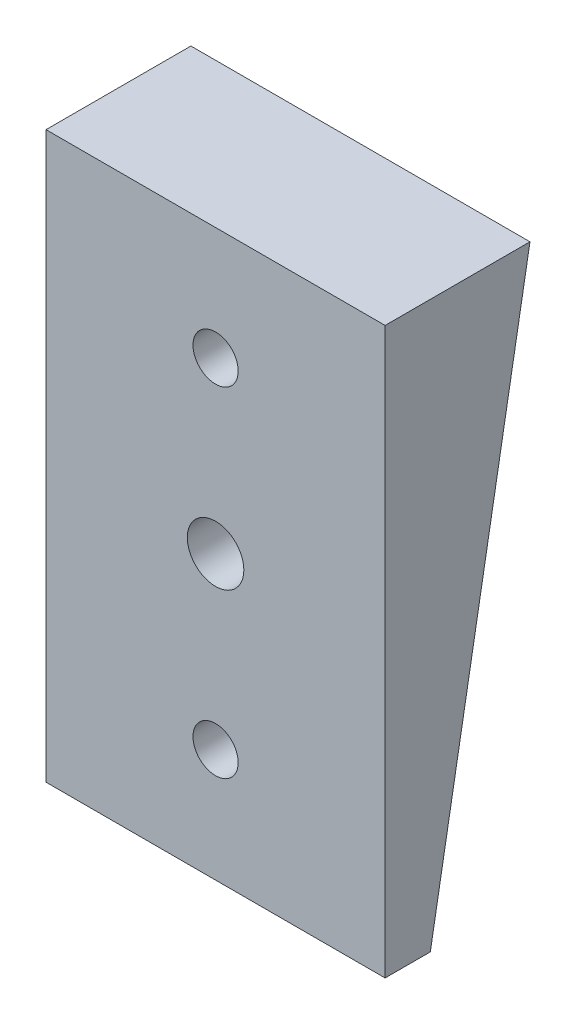
ISO-10303-21;
HEADER;
FILE_DESCRIPTION(('STEP AP214'),'2;1');
FILE_NAME('part.step','',(''),(''),'','','');
FILE_SCHEMA(('AUTOMOTIVE_DESIGN { 1 0 10303 214 1 1 1 1 }'));
ENDSEC;
DATA;
#1=APPLICATION_CONTEXT('core data for automotive mechanical design processes');
#2=APPLICATION_PROTOCOL_DEFINITION('international standard','automotive_design',2000,#1);
#3=PRODUCT_CONTEXT('',#1,'mechanical');
#4=PRODUCT('Part','Part','',(#3));
#5=PRODUCT_RELATED_PRODUCT_CATEGORY('part','',(#4));
#6=PRODUCT_DEFINITION_FORMATION('','',#4);
#7=PRODUCT_DEFINITION_CONTEXT('part definition',#1,'design');
#8=PRODUCT_DEFINITION('design','',#6,#7);
#9=PRODUCT_DEFINITION_SHAPE('','',#8);
#10=(LENGTH_UNIT() NAMED_UNIT(*) SI_UNIT(.MILLI.,.METRE.));
#11=(NAMED_UNIT(*) PLANE_ANGLE_UNIT() SI_UNIT($,.RADIAN.));
#12=(NAMED_UNIT(*) SI_UNIT($,.STERADIAN.) SOLID_ANGLE_UNIT());
#13=UNCERTAINTY_MEASURE_WITH_UNIT(LENGTH_MEASURE(1.E-05),#10,'distance_accuracy_value','');
#14=(GEOMETRIC_REPRESENTATION_CONTEXT(3) GLOBAL_UNCERTAINTY_ASSIGNED_CONTEXT((#13)) GLOBAL_UNIT_ASSIGNED_CONTEXT((#10,
#11,#12)) REPRESENTATION_CONTEXT('',''));
#15=CARTESIAN_POINT('',(0.,0.,0.));
#16=DIRECTION('',(0.,0.,1.));
#17=DIRECTION('',(1.,0.,0.));
#18=AXIS2_PLACEMENT_3D('',#15,#16,#17);
#19=CARTESIAN_POINT('',(30.,50.,-21.6326980708465));
#20=DIRECTION('',(0.,0.173648177666931,0.984807753012208));
#21=DIRECTION('',(0.,-0.984807753012208,0.173648177666931));
#22=AXIS2_PLACEMENT_3D('',#19,#20,#21);
#23=PLANE('',#22);
#24=CARTESIAN_POINT('',(0.,-30.,-7.52653961416931));
#25=DIRECTION('',(0.,0.173648177666931,0.984807753012208));
#26=DIRECTION('',(0.,-0.984807753012208,0.173648177666931));
#27=AXIS2_PLACEMENT_3D('',#24,#25,#26);
#28=ELLIPSE('',#27,4.06170644754298,4.);
#29=CARTESIAN_POINT('',(0.,-34.,-6.82123169133545));
#30=VERTEX_POINT('',#29);
#31=EDGE_CURVE('E105',#30,#30,#28,.T.);
#32=ORIENTED_EDGE('',*,*,#31,.T.);
#33=EDGE_LOOP('',(#32));
#34=FACE_BOUND('',#33,.T.);
#35=CARTESIAN_POINT('',(0.,30.,-18.1061584566772));
#36=DIRECTION('',(0.,0.173648177666931,0.984807753012208));
#37=DIRECTION('',(0.,-0.984807753012208,0.173648177666931));
#38=AXIS2_PLACEMENT_3D('',#35,#36,#37);
#39=ELLIPSE('',#38,4.06170644754298,4.);
#40=CARTESIAN_POINT('',(0.,26.,-17.4008505338434));
#41=VERTEX_POINT('',#40);
#42=EDGE_CURVE('E118',#41,#41,#39,.T.);
#43=ORIENTED_EDGE('',*,*,#42,.T.);
#44=EDGE_LOOP('',(#43));
#45=FACE_BOUND('',#44,.T.);
#46=CARTESIAN_POINT('',(0.,0.,-12.8163490354233));
#47=DIRECTION('',(0.,0.173648177666931,0.984807753012208));
#48=DIRECTION('',(0.,-0.984807753012208,0.173648177666931));
#49=AXIS2_PLACEMENT_3D('',#46,#47,#48);
#50=ELLIPSE('',#49,5.07713305942873,5.);
#51=CARTESIAN_POINT('',(0.,-5.,-11.9347141318809));
#52=VERTEX_POINT('',#51);
#53=EDGE_CURVE('E121',#52,#52,#50,.T.);
#54=ORIENTED_EDGE('',*,*,#53,.T.);
#55=EDGE_LOOP('',(#54));
#56=FACE_BOUND('',#55,.T.);
#57=DIRECTION('',(0.,0.984807753012208,-0.173648177666931));
#58=VECTOR('',#57,1.);
#59=CARTESIAN_POINT('',(-30.,50.,-21.6326980708465));
#60=LINE('',#59,#58);
#61=CARTESIAN_POINT('',(-30.,-50.,-4.00000000000001));
#62=VERTEX_POINT('',#61);
#63=CARTESIAN_POINT('',(-30.,50.,-21.6326980708465));
#64=VERTEX_POINT('',#63);
#65=EDGE_CURVE('E102',#62,#64,#60,.T.);
#66=ORIENTED_EDGE('',*,*,#65,.T.);
#67=DIRECTION('',(-1.,0.,0.));
#68=VECTOR('',#67,1.);
#69=CARTESIAN_POINT('',(30.,50.,-21.6326980708465));
#70=LINE('',#69,#68);
#71=CARTESIAN_POINT('',(30.,50.,-21.6326980708465));
#72=VERTEX_POINT('',#71);
#73=EDGE_CURVE('E11',#72,#64,#70,.T.);
#74=ORIENTED_EDGE('',*,*,#73,.F.);
#75=DIRECTION('',(0.,0.984807753012208,-0.173648177666931));
#76=VECTOR('',#75,1.);
#77=CARTESIAN_POINT('',(30.,50.,-21.6326980708465));
#78=LINE('',#77,#76);
#79=CARTESIAN_POINT('',(30.,-50.,-4.00000000000001));
#80=VERTEX_POINT('',#79);
#81=EDGE_CURVE('E90',#80,#72,#78,.T.);
#82=ORIENTED_EDGE('',*,*,#81,.F.);
#83=DIRECTION('',(-1.,0.,0.));
#84=VECTOR('',#83,1.);
#85=CARTESIAN_POINT('',(30.,-50.,-4.00000000000001));
#86=LINE('',#85,#84);
#87=EDGE_CURVE('E98',#80,#62,#86,.T.);
#88=ORIENTED_EDGE('',*,*,#87,.T.);
#89=EDGE_LOOP('',(#66,#74,#82,#88));
#90=FACE_BOUND('',#89,.T.);
#91=ADVANCED_FACE('F39',(#34,#45,#56,#90),#23,.F.);
#92=CARTESIAN_POINT('',(30.,50.,4.));
#93=DIRECTION('',(0.,-1.,0.));
#94=DIRECTION('',(0.,0.,-1.));
#95=AXIS2_PLACEMENT_3D('',#92,#93,#94);
#96=PLANE('',#95);
#97=DIRECTION('',(0.,0.,1.));
#98=VECTOR('',#97,1.);
#99=CARTESIAN_POINT('',(-30.,50.,4.));
#100=LINE('',#99,#98);
#101=CARTESIAN_POINT('',(-30.,50.,4.));
#102=VERTEX_POINT('',#101);
#103=EDGE_CURVE('E94',#64,#102,#100,.T.);
#104=ORIENTED_EDGE('',*,*,#103,.T.);
#105=DIRECTION('',(-1.,0.,0.));
#106=VECTOR('',#105,1.);
#107=CARTESIAN_POINT('',(30.,50.,4.));
#108=LINE('',#107,#106);
#109=CARTESIAN_POINT('',(30.,50.,4.));
#110=VERTEX_POINT('',#109);
#111=EDGE_CURVE('E47',#110,#102,#108,.T.);
#112=ORIENTED_EDGE('',*,*,#111,.F.);
#113=DIRECTION('',(0.,0.,1.));
#114=VECTOR('',#113,1.);
#115=CARTESIAN_POINT('',(30.,50.,-4.));
#116=LINE('',#115,#114);
#117=EDGE_CURVE('E85',#72,#110,#116,.T.);
#118=ORIENTED_EDGE('',*,*,#117,.F.);
#119=ORIENTED_EDGE('',*,*,#73,.T.);
#120=EDGE_LOOP('',(#104,#112,#118,#119));
#121=FACE_BOUND('',#120,.T.);
#122=ADVANCED_FACE('F93',(#121),#96,.F.);
#123=CARTESIAN_POINT('',(30.,50.,4.));
#124=DIRECTION('',(0.,0.,-1.));
#125=DIRECTION('',(0.,1.,0.));
#126=AXIS2_PLACEMENT_3D('',#123,#124,#125);
#127=PLANE('',#126);
#128=CARTESIAN_POINT('',(0.,-30.,4.));
#129=DIRECTION('',(0.,0.,1.));
#130=DIRECTION('',(1.,0.,0.));
#131=AXIS2_PLACEMENT_3D('',#128,#129,#130);
#132=CIRCLE('',#131,4.);
#133=CARTESIAN_POINT('',(4.00000000000001,-30.,4.));
#134=VERTEX_POINT('',#133);
#135=EDGE_CURVE('E124',#134,#134,#132,.T.);
#136=ORIENTED_EDGE('',*,*,#135,.F.);
#137=EDGE_LOOP('',(#136));
#138=FACE_BOUND('',#137,.T.);
#139=CARTESIAN_POINT('',(0.,30.,4.));
#140=DIRECTION('',(0.,0.,1.));
#141=DIRECTION('',(1.,0.,0.));
#142=AXIS2_PLACEMENT_3D('',#139,#140,#141);
#143=CIRCLE('',#142,4.);
#144=CARTESIAN_POINT('',(3.99999999999999,30.,4.));
#145=VERTEX_POINT('',#144);
#146=EDGE_CURVE('E128',#145,#145,#143,.T.);
#147=ORIENTED_EDGE('',*,*,#146,.F.);
#148=EDGE_LOOP('',(#147));
#149=FACE_BOUND('',#148,.T.);
#150=CARTESIAN_POINT('',(0.,0.,4.));
#151=DIRECTION('',(0.,0.,1.));
#152=DIRECTION('',(1.,0.,0.));
#153=AXIS2_PLACEMENT_3D('',#150,#151,#152);
#154=CIRCLE('',#153,5.);
#155=CARTESIAN_POINT('',(5.,0.,4.));
#156=VERTEX_POINT('',#155);
#157=EDGE_CURVE('E125',#156,#156,#154,.T.);
#158=ORIENTED_EDGE('',*,*,#157,.F.);
#159=EDGE_LOOP('',(#158));
#160=FACE_BOUND('',#159,.T.);
#161=DIRECTION('',(0.,-1.,0.));
#162=VECTOR('',#161,1.);
#163=CARTESIAN_POINT('',(-30.,50.,4.));
#164=LINE('',#163,#162);
#165=CARTESIAN_POINT('',(-30.,-50.,3.99999999999999));
#166=VERTEX_POINT('',#165);
#167=EDGE_CURVE('E72',#102,#166,#164,.T.);
#168=ORIENTED_EDGE('',*,*,#167,.T.);
#169=DIRECTION('',(-1.,0.,0.));
#170=VECTOR('',#169,1.);
#171=CARTESIAN_POINT('',(30.,-50.,3.99999999999999));
#172=LINE('',#171,#170);
#173=CARTESIAN_POINT('',(30.,-50.,3.99999999999999));
#174=VERTEX_POINT('',#173);
#175=EDGE_CURVE('E95',#174,#166,#172,.T.);
#176=ORIENTED_EDGE('',*,*,#175,.F.);
#177=DIRECTION('',(0.,-1.,0.));
#178=VECTOR('',#177,1.);
#179=CARTESIAN_POINT('',(30.,50.,4.));
#180=LINE('',#179,#178);
#181=EDGE_CURVE('E88',#110,#174,#180,.T.);
#182=ORIENTED_EDGE('',*,*,#181,.F.);
#183=ORIENTED_EDGE('',*,*,#111,.T.);
#184=EDGE_LOOP('',(#168,#176,#182,#183));
#185=FACE_BOUND('',#184,.T.);
#186=ADVANCED_FACE('F96',(#138,#149,#160,#185),#127,.F.);
#187=CARTESIAN_POINT('',(30.,-50.,3.99999999999999));
#188=DIRECTION('',(0.,1.,0.));
#189=DIRECTION('',(0.,0.,1.));
#190=AXIS2_PLACEMENT_3D('',#187,#188,#189);
#191=PLANE('',#190);
#192=DIRECTION('',(0.,0.,-1.));
#193=VECTOR('',#192,1.);
#194=CARTESIAN_POINT('',(-30.,-50.,3.99999999999999));
#195=LINE('',#194,#193);
#196=EDGE_CURVE('E78',#166,#62,#195,.T.);
#197=ORIENTED_EDGE('',*,*,#196,.T.);
#198=ORIENTED_EDGE('',*,*,#87,.F.);
#199=DIRECTION('',(0.,0.,-1.));
#200=VECTOR('',#199,1.);
#201=CARTESIAN_POINT('',(30.,-50.,3.99999999999999));
#202=LINE('',#201,#200);
#203=EDGE_CURVE('E55',#174,#80,#202,.T.);
#204=ORIENTED_EDGE('',*,*,#203,.F.);
#205=ORIENTED_EDGE('',*,*,#175,.T.);
#206=EDGE_LOOP('',(#197,#198,#204,#205));
#207=FACE_BOUND('',#206,.T.);
#208=ADVANCED_FACE('F110',(#207),#191,.F.);
#209=CARTESIAN_POINT('',(30.,0.,0.));
#210=DIRECTION('',(1.,0.,0.));
#211=DIRECTION('',(0.,0.,-1.));
#212=AXIS2_PLACEMENT_3D('',#209,#210,#211);
#213=PLANE('',#212);
#214=ORIENTED_EDGE('',*,*,#81,.T.);
#215=ORIENTED_EDGE('',*,*,#117,.T.);
#216=ORIENTED_EDGE('',*,*,#181,.T.);
#217=ORIENTED_EDGE('',*,*,#203,.T.);
#218=EDGE_LOOP('',(#214,#215,#216,#217));
#219=FACE_BOUND('',#218,.T.);
#220=ADVANCED_FACE('F86',(#219),#213,.T.);
#221=CARTESIAN_POINT('',(-30.,0.,0.));
#222=DIRECTION('',(1.,0.,0.));
#223=DIRECTION('',(0.,0.,-1.));
#224=AXIS2_PLACEMENT_3D('',#221,#222,#223);
#225=PLANE('',#224);
#226=ORIENTED_EDGE('',*,*,#65,.F.);
#227=ORIENTED_EDGE('',*,*,#196,.F.);
#228=ORIENTED_EDGE('',*,*,#167,.F.);
#229=ORIENTED_EDGE('',*,*,#103,.F.);
#230=EDGE_LOOP('',(#226,#227,#228,#229));
#231=FACE_BOUND('',#230,.T.);
#232=ADVANCED_FACE('F113',(#231),#225,.F.);
#233=CARTESIAN_POINT('',(0.,0.,-56.));
#234=DIRECTION('',(0.,0.,1.));
#235=DIRECTION('',(1.,0.,0.));
#236=AXIS2_PLACEMENT_3D('',#233,#234,#235);
#237=CYLINDRICAL_SURFACE('',#236,5.);
#238=ORIENTED_EDGE('',*,*,#157,.T.);
#239=EDGE_LOOP('',(#238));
#240=FACE_BOUND('',#239,.T.);
#241=ORIENTED_EDGE('',*,*,#53,.F.);
#242=EDGE_LOOP('',(#241));
#243=FACE_BOUND('',#242,.T.);
#244=ADVANCED_FACE('F144',(#240,#243),#237,.F.);
#245=CARTESIAN_POINT('',(0.,30.,-56.));
#246=DIRECTION('',(0.,0.,1.));
#247=DIRECTION('',(1.,0.,0.));
#248=AXIS2_PLACEMENT_3D('',#245,#246,#247);
#249=CYLINDRICAL_SURFACE('',#248,4.);
#250=ORIENTED_EDGE('',*,*,#146,.T.);
#251=EDGE_LOOP('',(#250));
#252=FACE_BOUND('',#251,.T.);
#253=ORIENTED_EDGE('',*,*,#42,.F.);
#254=EDGE_LOOP('',(#253));
#255=FACE_BOUND('',#254,.T.);
#256=ADVANCED_FACE('F147',(#252,#255),#249,.F.);
#257=CARTESIAN_POINT('',(0.,-30.,-56.));
#258=DIRECTION('',(0.,0.,1.));
#259=DIRECTION('',(1.,0.,0.));
#260=AXIS2_PLACEMENT_3D('',#257,#258,#259);
#261=CYLINDRICAL_SURFACE('',#260,4.);
#262=ORIENTED_EDGE('',*,*,#135,.T.);
#263=EDGE_LOOP('',(#262));
#264=FACE_BOUND('',#263,.T.);
#265=ORIENTED_EDGE('',*,*,#31,.F.);
#266=EDGE_LOOP('',(#265));
#267=FACE_BOUND('',#266,.T.);
#268=ADVANCED_FACE('F134',(#264,#267),#261,.F.);
#269=CLOSED_SHELL('',(#91,#122,#186,#208,#220,#232,#244,#256,#268));
#270=MANIFOLD_SOLID_BREP('B2',#269);
#271=ADVANCED_BREP_SHAPE_REPRESENTATION('',(#18,#270),#14);
#272=SHAPE_DEFINITION_REPRESENTATION(#9,#271);
ENDSEC;
END-ISO-10303-21;
